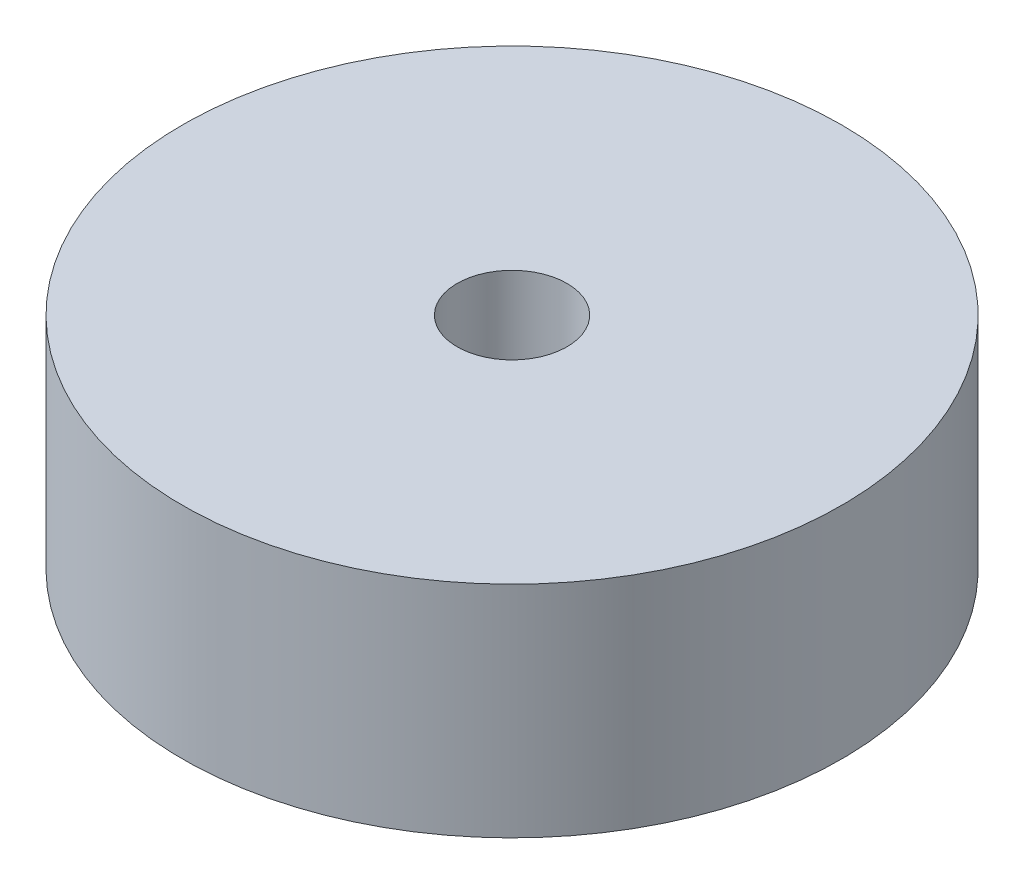
ISO-10303-21;
HEADER;
FILE_DESCRIPTION(('STEP AP214'),'2;1');
FILE_NAME('part.step','',(''),(''),'','','');
FILE_SCHEMA(('AUTOMOTIVE_DESIGN { 1 0 10303 214 1 1 1 1 }'));
ENDSEC;
DATA;
#1=APPLICATION_CONTEXT('core data for automotive mechanical design processes');
#2=APPLICATION_PROTOCOL_DEFINITION('international standard','automotive_design',2000,#1);
#3=PRODUCT_CONTEXT('',#1,'mechanical');
#4=PRODUCT('Part','Part','',(#3));
#5=PRODUCT_RELATED_PRODUCT_CATEGORY('part','',(#4));
#6=PRODUCT_DEFINITION_FORMATION('','',#4);
#7=PRODUCT_DEFINITION_CONTEXT('part definition',#1,'design');
#8=PRODUCT_DEFINITION('design','',#6,#7);
#9=PRODUCT_DEFINITION_SHAPE('','',#8);
#10=(LENGTH_UNIT() NAMED_UNIT(*) SI_UNIT(.MILLI.,.METRE.));
#11=(NAMED_UNIT(*) PLANE_ANGLE_UNIT() SI_UNIT($,.RADIAN.));
#12=(NAMED_UNIT(*) SI_UNIT($,.STERADIAN.) SOLID_ANGLE_UNIT());
#13=UNCERTAINTY_MEASURE_WITH_UNIT(LENGTH_MEASURE(1.E-05),#10,'distance_accuracy_value','');
#14=(GEOMETRIC_REPRESENTATION_CONTEXT(3) GLOBAL_UNCERTAINTY_ASSIGNED_CONTEXT((#13)) GLOBAL_UNIT_ASSIGNED_CONTEXT((#10,
#11,#12)) REPRESENTATION_CONTEXT('',''));
#15=CARTESIAN_POINT('',(0.,0.,0.));
#16=DIRECTION('',(0.,0.,1.));
#17=DIRECTION('',(1.,0.,0.));
#18=AXIS2_PLACEMENT_3D('',#15,#16,#17);
#19=CARTESIAN_POINT('',(0.,100.,0.));
#20=DIRECTION('',(0.,1.,0.));
#21=DIRECTION('',(0.,0.,1.));
#22=AXIS2_PLACEMENT_3D('',#19,#20,#21);
#23=PLANE('',#22);
#24=CARTESIAN_POINT('',(0.,100.,0.));
#25=DIRECTION('',(0.,1.,0.));
#26=DIRECTION('',(0.,0.,1.));
#27=AXIS2_PLACEMENT_3D('',#24,#25,#26);
#28=CIRCLE('',#27,150.);
#29=CARTESIAN_POINT('',(0.,100.,-150.));
#30=VERTEX_POINT('',#29);
#31=EDGE_CURVE('E11',#30,#30,#28,.T.);
#32=ORIENTED_EDGE('',*,*,#31,.T.);
#33=EDGE_LOOP('',(#32));
#34=FACE_BOUND('',#33,.T.);
#35=CARTESIAN_POINT('',(0.,100.,0.));
#36=DIRECTION('',(0.,1.,0.));
#37=DIRECTION('',(0.,0.,1.));
#38=AXIS2_PLACEMENT_3D('',#35,#36,#37);
#39=CIRCLE('',#38,25.);
#40=CARTESIAN_POINT('',(0.,100.,-25.));
#41=VERTEX_POINT('',#40);
#42=EDGE_CURVE('E52',#41,#41,#39,.T.);
#43=ORIENTED_EDGE('',*,*,#42,.F.);
#44=EDGE_LOOP('',(#43));
#45=FACE_BOUND('',#44,.T.);
#46=ADVANCED_FACE('F41',(#34,#45),#23,.T.);
#47=CARTESIAN_POINT('',(0.,0.,0.));
#48=DIRECTION('',(0.,1.,0.));
#49=DIRECTION('',(0.,0.,1.));
#50=AXIS2_PLACEMENT_3D('',#47,#48,#49);
#51=PLANE('',#50);
#52=CARTESIAN_POINT('',(0.,0.,0.));
#53=DIRECTION('',(0.,1.,0.));
#54=DIRECTION('',(0.,0.,1.));
#55=AXIS2_PLACEMENT_3D('',#52,#53,#54);
#56=CIRCLE('',#55,150.);
#57=CARTESIAN_POINT('',(0.,0.,-150.));
#58=VERTEX_POINT('',#57);
#59=EDGE_CURVE('E45',#58,#58,#56,.T.);
#60=ORIENTED_EDGE('',*,*,#59,.F.);
#61=EDGE_LOOP('',(#60));
#62=FACE_BOUND('',#61,.T.);
#63=CARTESIAN_POINT('',(0.,0.,0.));
#64=DIRECTION('',(0.,1.,0.));
#65=DIRECTION('',(0.,0.,1.));
#66=AXIS2_PLACEMENT_3D('',#63,#64,#65);
#67=CIRCLE('',#66,25.);
#68=CARTESIAN_POINT('',(0.,0.,-25.));
#69=VERTEX_POINT('',#68);
#70=EDGE_CURVE('E54',#69,#69,#67,.T.);
#71=ORIENTED_EDGE('',*,*,#70,.T.);
#72=EDGE_LOOP('',(#71));
#73=FACE_BOUND('',#72,.T.);
#74=ADVANCED_FACE('F64',(#62,#73),#51,.F.);
#75=CARTESIAN_POINT('',(0.,100.,0.));
#76=DIRECTION('',(0.,-1.,0.));
#77=DIRECTION('',(0.,0.,-1.));
#78=AXIS2_PLACEMENT_3D('',#75,#76,#77);
#79=CYLINDRICAL_SURFACE('',#78,150.);
#80=CARTESIAN_POINT('',(0.,100.,-150.));
#81=CARTESIAN_POINT('',(0.,98.9583333333333,-150.));
#82=CARTESIAN_POINT('',(0.,97.9166666666667,-150.));
#83=CARTESIAN_POINT('',(0.,95.8333333333333,-150.));
#84=CARTESIAN_POINT('',(0.,94.7916666666666,-150.));
#85=CARTESIAN_POINT('',(0.,92.7083333333333,-150.));
#86=CARTESIAN_POINT('',(0.,91.6666666666666,-150.));
#87=CARTESIAN_POINT('',(0.,89.5833333333333,-150.));
#88=CARTESIAN_POINT('',(0.,88.5416666666667,-150.));
#89=CARTESIAN_POINT('',(0.,86.4583333333333,-150.));
#90=CARTESIAN_POINT('',(0.,85.4166666666667,-150.));
#91=CARTESIAN_POINT('',(0.,83.3333333333333,-150.));
#92=CARTESIAN_POINT('',(0.,82.2916666666667,-150.));
#93=CARTESIAN_POINT('',(0.,80.2083333333333,-150.));
#94=CARTESIAN_POINT('',(0.,79.1666666666666,-150.));
#95=CARTESIAN_POINT('',(0.,77.0833333333333,-150.));
#96=CARTESIAN_POINT('',(0.,76.0416666666666,-150.));
#97=CARTESIAN_POINT('',(0.,73.9583333333333,-150.));
#98=CARTESIAN_POINT('',(0.,72.9166666666667,-150.));
#99=CARTESIAN_POINT('',(0.,70.8333333333333,-150.));
#100=CARTESIAN_POINT('',(0.,69.7916666666667,-150.));
#101=CARTESIAN_POINT('',(0.,67.7083333333333,-150.));
#102=CARTESIAN_POINT('',(0.,66.6666666666667,-150.));
#103=CARTESIAN_POINT('',(0.,64.5833333333333,-150.));
#104=CARTESIAN_POINT('',(0.,63.5416666666667,-150.));
#105=CARTESIAN_POINT('',(0.,61.4583333333333,-150.));
#106=CARTESIAN_POINT('',(0.,60.4166666666667,-150.));
#107=CARTESIAN_POINT('',(0.,58.3333333333333,-150.));
#108=CARTESIAN_POINT('',(0.,57.2916666666667,-150.));
#109=CARTESIAN_POINT('',(0.,55.2083333333333,-150.));
#110=CARTESIAN_POINT('',(0.,54.1666666666667,-150.));
#111=CARTESIAN_POINT('',(0.,52.0833333333333,-150.));
#112=CARTESIAN_POINT('',(0.,51.0416666666667,-150.));
#113=CARTESIAN_POINT('',(0.,48.9583333333333,-150.));
#114=CARTESIAN_POINT('',(0.,47.9166666666667,-150.));
#115=CARTESIAN_POINT('',(0.,45.8333333333333,-150.));
#116=CARTESIAN_POINT('',(0.,44.7916666666667,-150.));
#117=CARTESIAN_POINT('',(0.,42.7083333333333,-150.));
#118=CARTESIAN_POINT('',(0.,41.6666666666667,-150.));
#119=CARTESIAN_POINT('',(0.,39.5833333333333,-150.));
#120=CARTESIAN_POINT('',(0.,38.5416666666667,-150.));
#121=CARTESIAN_POINT('',(0.,36.4583333333333,-150.));
#122=CARTESIAN_POINT('',(0.,35.4166666666667,-150.));
#123=CARTESIAN_POINT('',(0.,33.3333333333333,-150.));
#124=CARTESIAN_POINT('',(0.,32.2916666666667,-150.));
#125=CARTESIAN_POINT('',(0.,30.2083333333333,-150.));
#126=CARTESIAN_POINT('',(0.,29.1666666666667,-150.));
#127=CARTESIAN_POINT('',(0.,27.0833333333333,-150.));
#128=CARTESIAN_POINT('',(0.,26.0416666666667,-150.));
#129=CARTESIAN_POINT('',(0.,23.9583333333333,-150.));
#130=CARTESIAN_POINT('',(0.,22.9166666666667,-150.));
#131=CARTESIAN_POINT('',(0.,20.8333333333333,-150.));
#132=CARTESIAN_POINT('',(0.,19.7916666666667,-150.));
#133=CARTESIAN_POINT('',(0.,17.7083333333333,-150.));
#134=CARTESIAN_POINT('',(0.,16.6666666666667,-150.));
#135=CARTESIAN_POINT('',(0.,14.5833333333333,-150.));
#136=CARTESIAN_POINT('',(0.,13.5416666666667,-150.));
#137=CARTESIAN_POINT('',(0.,11.4583333333333,-150.));
#138=CARTESIAN_POINT('',(0.,10.4166666666667,-150.));
#139=CARTESIAN_POINT('',(0.,8.33333333333333,-150.));
#140=CARTESIAN_POINT('',(0.,7.29166666666667,-150.));
#141=CARTESIAN_POINT('',(0.,5.20833333333334,-150.));
#142=CARTESIAN_POINT('',(0.,4.16666666666667,-150.));
#143=CARTESIAN_POINT('',(0.,2.08333333333334,-150.));
#144=CARTESIAN_POINT('',(0.,1.04166666666667,-150.));
#145=CARTESIAN_POINT('',(0.,0.,-150.));
#146=B_SPLINE_CURVE_WITH_KNOTS('',3,(#80,#81,#82,#83,#84,#85,#86,#87,#88,#89,#90,#91,#92,#93,
#94,#95,#96,#97,#98,#99,#100,#101,#102,#103,#104,#105,#106,#107,#108,#109,#110,#111,#112,#113,
#114,#115,#116,#117,#118,#119,#120,#121,#122,#123,#124,#125,#126,#127,#128,#129,#130,#131,#132,
#133,#134,#135,#136,#137,#138,#139,#140,#141,#142,#143,#144,#145),.UNSPECIFIED.,.F.,.F.,(4,2,2,
2,2,2,2,2,2,2,2,2,2,2,2,2,2,2,2,2,2,2,2,2,2,2,2,2,2,2,2,2,4),(0.,3.12499999999999,
6.24999999999999,9.37499999999999,12.5,15.625,18.75,21.875,25.,28.125,31.25,34.375,37.5,40.625,
43.75,46.875,50.,53.125,56.25,59.375,62.5,65.625,68.75,71.875,75.,78.125,81.25,84.375,87.5,
90.625,93.75,96.875,100.),.UNSPECIFIED.);
#147=EDGE_CURVE('BSEAM43',#30,#58,#146,.T.);
#148=ORIENTED_EDGE('',*,*,#31,.F.);
#149=ORIENTED_EDGE('',*,*,#59,.T.);
#150=ORIENTED_EDGE('',*,*,#147,.T.);
#151=ORIENTED_EDGE('',*,*,#147,.F.);
#152=EDGE_LOOP('',(#148,#150,#149,#151));
#153=FACE_BOUND('',#152,.T.);
#154=ADVANCED_FACE('F43',(#153),#79,.T.);
#155=CARTESIAN_POINT('',(0.,100.,0.));
#156=DIRECTION('',(0.,-1.,0.));
#157=DIRECTION('',(0.,0.,-1.));
#158=AXIS2_PLACEMENT_3D('',#155,#156,#157);
#159=CYLINDRICAL_SURFACE('',#158,25.);
#160=CARTESIAN_POINT('',(0.,100.,-25.));
#161=CARTESIAN_POINT('',(0.,98.9583333333333,-25.));
#162=CARTESIAN_POINT('',(0.,97.9166666666667,-25.));
#163=CARTESIAN_POINT('',(0.,95.8333333333333,-25.));
#164=CARTESIAN_POINT('',(0.,94.7916666666666,-25.));
#165=CARTESIAN_POINT('',(0.,92.7083333333333,-25.));
#166=CARTESIAN_POINT('',(0.,91.6666666666666,-25.));
#167=CARTESIAN_POINT('',(0.,89.5833333333333,-25.));
#168=CARTESIAN_POINT('',(0.,88.5416666666666,-25.));
#169=CARTESIAN_POINT('',(0.,86.4583333333333,-25.));
#170=CARTESIAN_POINT('',(0.,85.4166666666667,-25.));
#171=CARTESIAN_POINT('',(0.,83.3333333333333,-25.));
#172=CARTESIAN_POINT('',(0.,82.2916666666667,-25.));
#173=CARTESIAN_POINT('',(0.,80.2083333333333,-25.));
#174=CARTESIAN_POINT('',(0.,79.1666666666666,-25.));
#175=CARTESIAN_POINT('',(0.,77.0833333333333,-25.));
#176=CARTESIAN_POINT('',(0.,76.0416666666666,-25.));
#177=CARTESIAN_POINT('',(0.,73.9583333333333,-25.));
#178=CARTESIAN_POINT('',(0.,72.9166666666667,-25.));
#179=CARTESIAN_POINT('',(0.,70.8333333333333,-25.));
#180=CARTESIAN_POINT('',(0.,69.7916666666667,-25.));
#181=CARTESIAN_POINT('',(0.,67.7083333333333,-25.));
#182=CARTESIAN_POINT('',(0.,66.6666666666667,-25.));
#183=CARTESIAN_POINT('',(0.,64.5833333333333,-25.));
#184=CARTESIAN_POINT('',(0.,63.5416666666667,-25.));
#185=CARTESIAN_POINT('',(0.,61.4583333333333,-25.));
#186=CARTESIAN_POINT('',(0.,60.4166666666667,-25.));
#187=CARTESIAN_POINT('',(0.,58.3333333333333,-25.));
#188=CARTESIAN_POINT('',(0.,57.2916666666667,-25.));
#189=CARTESIAN_POINT('',(0.,55.2083333333333,-25.));
#190=CARTESIAN_POINT('',(0.,54.1666666666667,-25.));
#191=CARTESIAN_POINT('',(0.,52.0833333333333,-25.));
#192=CARTESIAN_POINT('',(0.,51.0416666666667,-25.));
#193=CARTESIAN_POINT('',(0.,48.9583333333333,-25.));
#194=CARTESIAN_POINT('',(0.,47.9166666666667,-25.));
#195=CARTESIAN_POINT('',(0.,45.8333333333333,-25.));
#196=CARTESIAN_POINT('',(0.,44.7916666666667,-25.));
#197=CARTESIAN_POINT('',(0.,42.7083333333333,-25.));
#198=CARTESIAN_POINT('',(0.,41.6666666666667,-25.));
#199=CARTESIAN_POINT('',(0.,39.5833333333333,-25.));
#200=CARTESIAN_POINT('',(0.,38.5416666666667,-25.));
#201=CARTESIAN_POINT('',(0.,36.4583333333333,-25.));
#202=CARTESIAN_POINT('',(0.,35.4166666666667,-25.));
#203=CARTESIAN_POINT('',(0.,33.3333333333333,-25.));
#204=CARTESIAN_POINT('',(0.,32.2916666666667,-25.));
#205=CARTESIAN_POINT('',(0.,30.2083333333333,-25.));
#206=CARTESIAN_POINT('',(0.,29.1666666666667,-25.));
#207=CARTESIAN_POINT('',(0.,27.0833333333333,-25.));
#208=CARTESIAN_POINT('',(0.,26.0416666666667,-25.));
#209=CARTESIAN_POINT('',(0.,23.9583333333333,-25.));
#210=CARTESIAN_POINT('',(0.,22.9166666666667,-25.));
#211=CARTESIAN_POINT('',(0.,20.8333333333333,-25.));
#212=CARTESIAN_POINT('',(0.,19.7916666666667,-25.));
#213=CARTESIAN_POINT('',(0.,17.7083333333333,-25.));
#214=CARTESIAN_POINT('',(0.,16.6666666666667,-25.));
#215=CARTESIAN_POINT('',(0.,14.5833333333333,-25.));
#216=CARTESIAN_POINT('',(0.,13.5416666666667,-25.));
#217=CARTESIAN_POINT('',(0.,11.4583333333333,-25.));
#218=CARTESIAN_POINT('',(0.,10.4166666666667,-25.));
#219=CARTESIAN_POINT('',(0.,8.33333333333333,-25.));
#220=CARTESIAN_POINT('',(0.,7.29166666666667,-25.));
#221=CARTESIAN_POINT('',(0.,5.20833333333334,-25.));
#222=CARTESIAN_POINT('',(0.,4.16666666666667,-25.));
#223=CARTESIAN_POINT('',(0.,2.08333333333334,-25.));
#224=CARTESIAN_POINT('',(0.,1.04166666666667,-25.));
#225=CARTESIAN_POINT('',(0.,0.,-25.));
#226=B_SPLINE_CURVE_WITH_KNOTS('',3,(#160,#161,#162,#163,#164,#165,#166,#167,#168,#169,#170,
#171,#172,#173,#174,#175,#176,#177,#178,#179,#180,#181,#182,#183,#184,#185,#186,#187,#188,#189,
#190,#191,#192,#193,#194,#195,#196,#197,#198,#199,#200,#201,#202,#203,#204,#205,#206,#207,#208,
#209,#210,#211,#212,#213,#214,#215,#216,#217,#218,#219,#220,#221,#222,#223,#224,#225),
.UNSPECIFIED.,.F.,.F.,(4,2,2,2,2,2,2,2,2,2,2,2,2,2,2,2,2,2,2,2,2,2,2,2,2,2,2,2,2,2,2,2,4),(0.,
3.125,6.25000000000001,9.37500000000001,12.5,15.625,18.75,21.875,25.,28.125,31.25,34.375,37.5,
40.625,43.75,46.875,50.,53.125,56.25,59.375,62.5,65.625,68.75,71.875,75.,78.125,81.25,84.375,
87.5,90.625,93.75,96.875,100.),.UNSPECIFIED.);
#227=EDGE_CURVE('BSEAM60',#41,#69,#226,.T.);
#228=ORIENTED_EDGE('',*,*,#42,.T.);
#229=ORIENTED_EDGE('',*,*,#70,.F.);
#230=ORIENTED_EDGE('',*,*,#227,.T.);
#231=ORIENTED_EDGE('',*,*,#227,.F.);
#232=EDGE_LOOP('',(#228,#230,#229,#231));
#233=FACE_BOUND('',#232,.T.);
#234=ADVANCED_FACE('F60',(#233),#159,.F.);
#235=CLOSED_SHELL('',(#46,#74,#154,#234));
#236=MANIFOLD_SOLID_BREP('B2',#235);
#237=ADVANCED_BREP_SHAPE_REPRESENTATION('',(#18,#236),#14);
#238=SHAPE_DEFINITION_REPRESENTATION(#9,#237);
ENDSEC;
END-ISO-10303-21;
